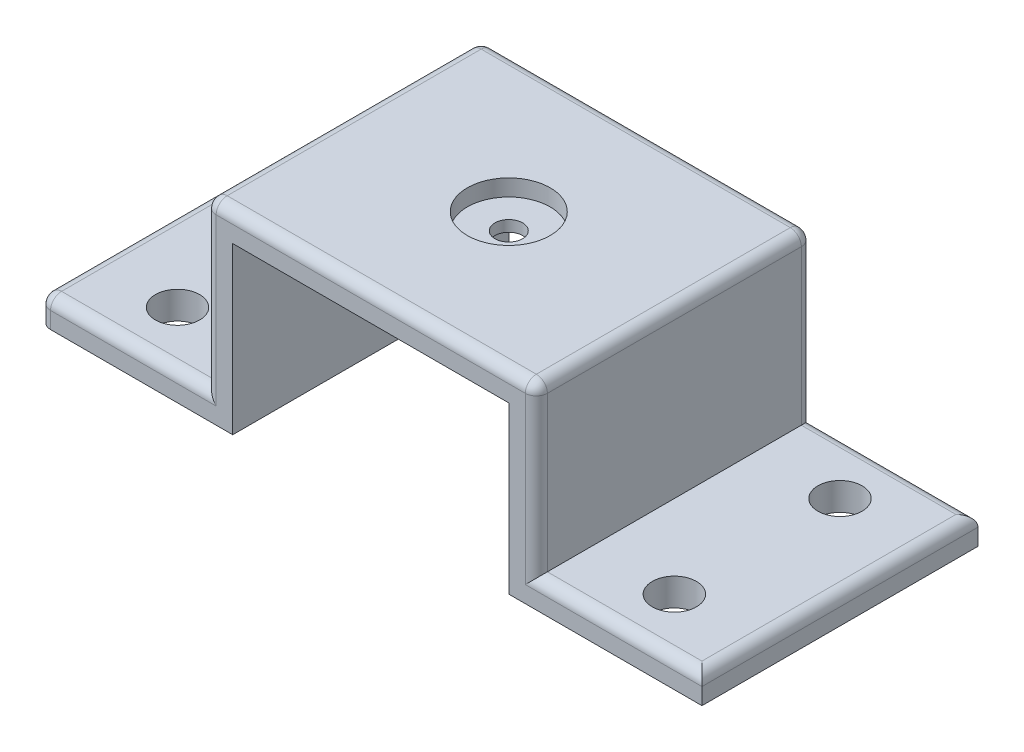
ISO-10303-21;
HEADER;
FILE_DESCRIPTION(('STEP AP214'),'2;1');
FILE_NAME('part.step','',(''),(''),'','','');
FILE_SCHEMA(('AUTOMOTIVE_DESIGN { 1 0 10303 214 1 1 1 1 }'));
ENDSEC;
DATA;
#1=APPLICATION_CONTEXT('core data for automotive mechanical design processes');
#2=APPLICATION_PROTOCOL_DEFINITION('international standard','automotive_design',2000,#1);
#3=PRODUCT_CONTEXT('',#1,'mechanical');
#4=PRODUCT('Part','Part','',(#3));
#5=PRODUCT_RELATED_PRODUCT_CATEGORY('part','',(#4));
#6=PRODUCT_DEFINITION_FORMATION('','',#4);
#7=PRODUCT_DEFINITION_CONTEXT('part definition',#1,'design');
#8=PRODUCT_DEFINITION('design','',#6,#7);
#9=PRODUCT_DEFINITION_SHAPE('','',#8);
#10=(LENGTH_UNIT() NAMED_UNIT(*) SI_UNIT(.MILLI.,.METRE.));
#11=(NAMED_UNIT(*) PLANE_ANGLE_UNIT() SI_UNIT($,.RADIAN.));
#12=(NAMED_UNIT(*) SI_UNIT($,.STERADIAN.) SOLID_ANGLE_UNIT());
#13=UNCERTAINTY_MEASURE_WITH_UNIT(LENGTH_MEASURE(1.E-05),#10,'distance_accuracy_value','');
#14=(GEOMETRIC_REPRESENTATION_CONTEXT(3) GLOBAL_UNCERTAINTY_ASSIGNED_CONTEXT((#13)) GLOBAL_UNIT_ASSIGNED_CONTEXT((#10,
#11,#12)) REPRESENTATION_CONTEXT('',''));
#15=CARTESIAN_POINT('',(0.,0.,0.));
#16=DIRECTION('',(0.,0.,1.));
#17=DIRECTION('',(1.,0.,0.));
#18=AXIS2_PLACEMENT_3D('',#15,#16,#17);
#19=CARTESIAN_POINT('',(38.1,31.75,31.75));
#20=DIRECTION('',(0.,1.,0.));
#21=DIRECTION('',(-1.,0.,0.));
#22=AXIS2_PLACEMENT_3D('',#19,#20,#21);
#23=PLANE('',#22);
#24=CARTESIAN_POINT('',(57.15,31.75,19.05));
#25=DIRECTION('',(0.,1.,0.));
#26=DIRECTION('',(0.,0.,1.));
#27=AXIS2_PLACEMENT_3D('',#24,#25,#26);
#28=CIRCLE('',#27,5.08);
#29=CARTESIAN_POINT('',(57.15,31.75,24.13));
#30=VERTEX_POINT('',#29);
#31=EDGE_CURVE('E433',#30,#30,#28,.T.);
#32=ORIENTED_EDGE('',*,*,#31,.T.);
#33=EDGE_LOOP('',(#32));
#34=FACE_BOUND('',#33,.T.);
#35=CARTESIAN_POINT('',(57.15,31.75,-19.05));
#36=DIRECTION('',(0.,1.,0.));
#37=DIRECTION('',(0.,0.,1.));
#38=AXIS2_PLACEMENT_3D('',#35,#36,#37);
#39=CIRCLE('',#38,5.08);
#40=CARTESIAN_POINT('',(57.15,31.75,-13.97));
#41=VERTEX_POINT('',#40);
#42=EDGE_CURVE('E414',#41,#41,#39,.T.);
#43=ORIENTED_EDGE('',*,*,#42,.T.);
#44=EDGE_LOOP('',(#43));
#45=FACE_BOUND('',#44,.T.);
#46=DIRECTION('',(1.,0.,0.));
#47=VECTOR('',#46,1.);
#48=CARTESIAN_POINT('',(38.1,31.75,-31.75));
#49=LINE('',#48,#47);
#50=CARTESIAN_POINT('',(31.75,31.75,-31.75));
#51=VERTEX_POINT('',#50);
#52=CARTESIAN_POINT('',(76.2,31.75,-31.75));
#53=VERTEX_POINT('',#52);
#54=EDGE_CURVE('E218',#51,#53,#49,.T.);
#55=ORIENTED_EDGE('',*,*,#54,.T.);
#56=DIRECTION('',(0.,0.,-1.));
#57=VECTOR('',#56,1.);
#58=CARTESIAN_POINT('',(76.2,31.75,31.75));
#59=LINE('',#58,#57);
#60=CARTESIAN_POINT('',(76.2,31.75,31.75));
#61=VERTEX_POINT('',#60);
#62=EDGE_CURVE('E197',#61,#53,#59,.T.);
#63=ORIENTED_EDGE('',*,*,#62,.F.);
#64=DIRECTION('',(1.,0.,0.));
#65=VECTOR('',#64,1.);
#66=CARTESIAN_POINT('',(38.1,31.75,31.75));
#67=LINE('',#66,#65);
#68=CARTESIAN_POINT('',(31.75,31.75,31.75));
#69=VERTEX_POINT('',#68);
#70=EDGE_CURVE('E205',#69,#61,#67,.T.);
#71=ORIENTED_EDGE('',*,*,#70,.F.);
#72=DIRECTION('',(0.,0.,-1.));
#73=VECTOR('',#72,1.);
#74=CARTESIAN_POINT('',(31.75,31.75,31.75));
#75=LINE('',#74,#73);
#76=EDGE_CURVE('E454',#69,#51,#75,.T.);
#77=ORIENTED_EDGE('',*,*,#76,.T.);
#78=EDGE_LOOP('',(#55,#63,#71,#77));
#79=FACE_BOUND('',#78,.T.);
#80=ADVANCED_FACE('F47',(#34,#45,#79),#23,.F.);
#81=CARTESIAN_POINT('',(76.2,38.1,31.75));
#82=DIRECTION('',(1.,0.,0.));
#83=DIRECTION('',(0.,0.,-1.));
#84=AXIS2_PLACEMENT_3D('',#81,#82,#83);
#85=PLANE('',#84);
#86=DIRECTION('',(0.,-1.,0.));
#87=VECTOR('',#86,1.);
#88=CARTESIAN_POINT('',(76.2,38.1,-31.75));
#89=LINE('',#88,#87);
#90=CARTESIAN_POINT('',(76.2,35.56,-31.75));
#91=VERTEX_POINT('',#90);
#92=EDGE_CURVE('E457',#91,#53,#89,.T.);
#93=ORIENTED_EDGE('',*,*,#92,.F.);
#94=DIRECTION('',(0.,0.,-1.));
#95=VECTOR('',#94,1.);
#96=CARTESIAN_POINT('',(76.2,35.56,31.75));
#97=LINE('',#96,#95);
#98=CARTESIAN_POINT('',(76.2,35.56,31.75));
#99=VERTEX_POINT('',#98);
#100=EDGE_CURVE('E200',#91,#99,#97,.F.);
#101=ORIENTED_EDGE('',*,*,#100,.T.);
#102=DIRECTION('',(0.,-1.,0.));
#103=VECTOR('',#102,1.);
#104=CARTESIAN_POINT('',(76.2,38.1,31.75));
#105=LINE('',#104,#103);
#106=EDGE_CURVE('E192',#99,#61,#105,.T.);
#107=ORIENTED_EDGE('',*,*,#106,.T.);
#108=ORIENTED_EDGE('',*,*,#62,.T.);
#109=EDGE_LOOP('',(#93,#101,#107,#108));
#110=FACE_BOUND('',#109,.T.);
#111=ADVANCED_FACE('F195',(#110),#85,.T.);
#112=CARTESIAN_POINT('',(38.1,38.1,31.75));
#113=DIRECTION('',(0.,1.,0.));
#114=DIRECTION('',(-1.,0.,0.));
#115=AXIS2_PLACEMENT_3D('',#112,#113,#114);
#116=PLANE('',#115);
#117=CARTESIAN_POINT('',(57.15,38.1,19.05));
#118=DIRECTION('',(0.,1.,0.));
#119=DIRECTION('',(0.,0.,1.));
#120=AXIS2_PLACEMENT_3D('',#117,#118,#119);
#121=CIRCLE('',#120,5.08);
#122=CARTESIAN_POINT('',(57.15,38.1,24.13));
#123=VERTEX_POINT('',#122);
#124=EDGE_CURVE('E693',#123,#123,#121,.T.);
#125=ORIENTED_EDGE('',*,*,#124,.F.);
#126=EDGE_LOOP('',(#125));
#127=FACE_BOUND('',#126,.T.);
#128=CARTESIAN_POINT('',(57.15,38.1,-19.05));
#129=DIRECTION('',(0.,1.,0.));
#130=DIRECTION('',(0.,0.,1.));
#131=AXIS2_PLACEMENT_3D('',#128,#129,#130);
#132=CIRCLE('',#131,5.08);
#133=CARTESIAN_POINT('',(57.15,38.1,-13.97));
#134=VERTEX_POINT('',#133);
#135=EDGE_CURVE('E408',#134,#134,#132,.T.);
#136=ORIENTED_EDGE('',*,*,#135,.F.);
#137=EDGE_LOOP('',(#136));
#138=FACE_BOUND('',#137,.T.);
#139=DIRECTION('',(0.,0.,-1.));
#140=VECTOR('',#139,1.);
#141=CARTESIAN_POINT('',(73.66,38.1,31.75));
#142=LINE('',#141,#140);
#143=CARTESIAN_POINT('',(73.66,38.1,29.21));
#144=VERTEX_POINT('',#143);
#145=CARTESIAN_POINT('',(73.66,38.1,-29.21));
#146=VERTEX_POINT('',#145);
#147=EDGE_CURVE('E291',#144,#146,#142,.T.);
#148=ORIENTED_EDGE('',*,*,#147,.T.);
#149=DIRECTION('',(1.,0.,0.));
#150=VECTOR('',#149,1.);
#151=CARTESIAN_POINT('',(38.1,38.1,-29.21));
#152=LINE('',#151,#150);
#153=CARTESIAN_POINT('',(38.1,38.1,-29.21));
#154=VERTEX_POINT('',#153);
#155=EDGE_CURVE('E297',#146,#154,#152,.F.);
#156=ORIENTED_EDGE('',*,*,#155,.T.);
#157=DIRECTION('',(0.,0.,-1.));
#158=VECTOR('',#157,1.);
#159=CARTESIAN_POINT('',(38.1,38.1,31.75));
#160=LINE('',#159,#158);
#161=CARTESIAN_POINT('',(38.1,38.1,29.21));
#162=VERTEX_POINT('',#161);
#163=EDGE_CURVE('E221',#162,#154,#160,.T.);
#164=ORIENTED_EDGE('',*,*,#163,.F.);
#165=DIRECTION('',(1.,0.,0.));
#166=VECTOR('',#165,1.);
#167=CARTESIAN_POINT('',(76.2,38.1,29.21));
#168=LINE('',#167,#166);
#169=EDGE_CURVE('E294',#162,#144,#168,.T.);
#170=ORIENTED_EDGE('',*,*,#169,.T.);
#171=EDGE_LOOP('',(#148,#156,#164,#170));
#172=FACE_BOUND('',#171,.T.);
#173=ADVANCED_FACE('F559',(#127,#138,#172),#116,.T.);
#174=CARTESIAN_POINT('',(38.1,76.2,31.75));
#175=DIRECTION('',(1.,0.,0.));
#176=DIRECTION('',(0.,0.,-1.));
#177=AXIS2_PLACEMENT_3D('',#174,#175,#176);
#178=PLANE('',#177);
#179=ORIENTED_EDGE('',*,*,#163,.T.);
#180=DIRECTION('',(0.,-1.,0.));
#181=VECTOR('',#180,1.);
#182=CARTESIAN_POINT('',(38.1,76.2,-29.21));
#183=LINE('',#182,#181);
#184=CARTESIAN_POINT('',(38.1,73.66,-29.21));
#185=VERTEX_POINT('',#184);
#186=EDGE_CURVE('E279',#154,#185,#183,.F.);
#187=ORIENTED_EDGE('',*,*,#186,.T.);
#188=DIRECTION('',(0.,0.,-1.));
#189=VECTOR('',#188,1.);
#190=CARTESIAN_POINT('',(38.1,73.66,31.75));
#191=LINE('',#190,#189);
#192=CARTESIAN_POINT('',(38.1,73.66,29.21));
#193=VERTEX_POINT('',#192);
#194=EDGE_CURVE('E275',#185,#193,#191,.F.);
#195=ORIENTED_EDGE('',*,*,#194,.T.);
#196=DIRECTION('',(0.,-1.,0.));
#197=VECTOR('',#196,1.);
#198=CARTESIAN_POINT('',(38.1,38.1,29.21));
#199=LINE('',#198,#197);
#200=EDGE_CURVE('E272',#193,#162,#199,.T.);
#201=ORIENTED_EDGE('',*,*,#200,.T.);
#202=EDGE_LOOP('',(#179,#187,#195,#201));
#203=FACE_BOUND('',#202,.T.);
#204=ADVANCED_FACE('F562',(#203),#178,.T.);
#205=CARTESIAN_POINT('',(-38.1,76.2,31.75));
#206=DIRECTION('',(0.,1.,0.));
#207=DIRECTION('',(0.,0.,1.));
#208=AXIS2_PLACEMENT_3D('',#205,#206,#207);
#209=PLANE('',#208);
#210=DIRECTION('',(0.,0.,-1.));
#211=VECTOR('',#210,1.);
#212=CARTESIAN_POINT('',(35.56,76.2,31.75));
#213=LINE('',#212,#211);
#214=CARTESIAN_POINT('',(35.56,76.2,29.21));
#215=VERTEX_POINT('',#214);
#216=CARTESIAN_POINT('',(35.56,76.2,-29.21));
#217=VERTEX_POINT('',#216);
#218=EDGE_CURVE('E246',#215,#217,#213,.T.);
#219=ORIENTED_EDGE('',*,*,#218,.T.);
#220=DIRECTION('',(1.,0.,0.));
#221=VECTOR('',#220,1.);
#222=CARTESIAN_POINT('',(-38.1,76.2,-29.21));
#223=LINE('',#222,#221);
#224=CARTESIAN_POINT('',(-35.56,76.2,-29.21));
#225=VERTEX_POINT('',#224);
#226=EDGE_CURVE('E253',#217,#225,#223,.F.);
#227=ORIENTED_EDGE('',*,*,#226,.T.);
#228=DIRECTION('',(0.,0.,-1.));
#229=VECTOR('',#228,1.);
#230=CARTESIAN_POINT('',(-35.56,76.2,31.75));
#231=LINE('',#230,#229);
#232=CARTESIAN_POINT('',(-35.56,76.2,29.21));
#233=VERTEX_POINT('',#232);
#234=EDGE_CURVE('E249',#225,#233,#231,.F.);
#235=ORIENTED_EDGE('',*,*,#234,.T.);
#236=DIRECTION('',(1.,0.,0.));
#237=VECTOR('',#236,1.);
#238=CARTESIAN_POINT('',(38.1,76.2,29.21));
#239=LINE('',#238,#237);
#240=EDGE_CURVE('E243',#233,#215,#239,.T.);
#241=ORIENTED_EDGE('',*,*,#240,.T.);
#242=EDGE_LOOP('',(#219,#227,#235,#241));
#243=FACE_BOUND('',#242,.T.);
#244=CARTESIAN_POINT('',(0.,76.2,0.));
#245=DIRECTION('',(0.,1.,0.));
#246=DIRECTION('',(0.,0.,1.));
#247=AXIS2_PLACEMENT_3D('',#244,#245,#246);
#248=CIRCLE('',#247,9.525);
#249=CARTESIAN_POINT('',(0.,76.2,9.525));
#250=VERTEX_POINT('',#249);
#251=EDGE_CURVE('E428',#250,#250,#248,.T.);
#252=ORIENTED_EDGE('',*,*,#251,.F.);
#253=EDGE_LOOP('',(#252));
#254=FACE_BOUND('',#253,.T.);
#255=ADVANCED_FACE('F681',(#243,#254),#209,.T.);
#256=CARTESIAN_POINT('',(-38.1,38.1,31.75));
#257=DIRECTION('',(-1.,0.,0.));
#258=DIRECTION('',(0.,0.,1.));
#259=AXIS2_PLACEMENT_3D('',#256,#257,#258);
#260=PLANE('',#259);
#261=DIRECTION('',(0.,0.,-1.));
#262=VECTOR('',#261,1.);
#263=CARTESIAN_POINT('',(-38.1,73.66,31.75));
#264=LINE('',#263,#262);
#265=CARTESIAN_POINT('',(-38.1,73.66,29.21));
#266=VERTEX_POINT('',#265);
#267=CARTESIAN_POINT('',(-38.1,73.66,-29.21));
#268=VERTEX_POINT('',#267);
#269=EDGE_CURVE('E225',#266,#268,#264,.T.);
#270=ORIENTED_EDGE('',*,*,#269,.T.);
#271=DIRECTION('',(0.,1.,0.));
#272=VECTOR('',#271,1.);
#273=CARTESIAN_POINT('',(-38.1,38.1,-29.21));
#274=LINE('',#273,#272);
#275=CARTESIAN_POINT('',(-38.1,38.1,-29.21));
#276=VERTEX_POINT('',#275);
#277=EDGE_CURVE('E240',#268,#276,#274,.F.);
#278=ORIENTED_EDGE('',*,*,#277,.T.);
#279=DIRECTION('',(0.,0.,-1.));
#280=VECTOR('',#279,1.);
#281=CARTESIAN_POINT('',(-38.1,38.1,31.75));
#282=LINE('',#281,#280);
#283=CARTESIAN_POINT('',(-38.1,38.1,29.21));
#284=VERTEX_POINT('',#283);
#285=EDGE_CURVE('E228',#284,#276,#282,.T.);
#286=ORIENTED_EDGE('',*,*,#285,.F.);
#287=DIRECTION('',(0.,1.,0.));
#288=VECTOR('',#287,1.);
#289=CARTESIAN_POINT('',(-38.1,76.2,29.21));
#290=LINE('',#289,#288);
#291=EDGE_CURVE('E220',#284,#266,#290,.T.);
#292=ORIENTED_EDGE('',*,*,#291,.T.);
#293=EDGE_LOOP('',(#270,#278,#286,#292));
#294=FACE_BOUND('',#293,.T.);
#295=ADVANCED_FACE('F535',(#294),#260,.T.);
#296=CARTESIAN_POINT('',(-76.2,38.1,31.75));
#297=DIRECTION('',(0.,1.,0.));
#298=DIRECTION('',(0.,0.,1.));
#299=AXIS2_PLACEMENT_3D('',#296,#297,#298);
#300=PLANE('',#299);
#301=ORIENTED_EDGE('',*,*,#285,.T.);
#302=DIRECTION('',(1.,0.,0.));
#303=VECTOR('',#302,1.);
#304=CARTESIAN_POINT('',(-76.2,38.1,-29.21));
#305=LINE('',#304,#303);
#306=CARTESIAN_POINT('',(-73.66,38.1,-29.21));
#307=VERTEX_POINT('',#306);
#308=EDGE_CURVE('E288',#276,#307,#305,.F.);
#309=ORIENTED_EDGE('',*,*,#308,.T.);
#310=DIRECTION('',(0.,0.,-1.));
#311=VECTOR('',#310,1.);
#312=CARTESIAN_POINT('',(-73.66,38.1,31.75));
#313=LINE('',#312,#311);
#314=CARTESIAN_POINT('',(-73.66,38.1,29.21));
#315=VERTEX_POINT('',#314);
#316=EDGE_CURVE('E282',#307,#315,#313,.F.);
#317=ORIENTED_EDGE('',*,*,#316,.T.);
#318=DIRECTION('',(1.,0.,0.));
#319=VECTOR('',#318,1.);
#320=CARTESIAN_POINT('',(-38.1,38.1,29.21));
#321=LINE('',#320,#319);
#322=EDGE_CURVE('E285',#315,#284,#321,.T.);
#323=ORIENTED_EDGE('',*,*,#322,.T.);
#324=EDGE_LOOP('',(#301,#309,#317,#323));
#325=FACE_BOUND('',#324,.T.);
#326=CARTESIAN_POINT('',(-57.15,38.1,-19.05));
#327=DIRECTION('',(0.,1.,0.));
#328=DIRECTION('',(0.,0.,1.));
#329=AXIS2_PLACEMENT_3D('',#326,#327,#328);
#330=CIRCLE('',#329,5.08);
#331=CARTESIAN_POINT('',(-57.15,38.1,-13.97));
#332=VERTEX_POINT('',#331);
#333=EDGE_CURVE('E420',#332,#332,#330,.T.);
#334=ORIENTED_EDGE('',*,*,#333,.F.);
#335=EDGE_LOOP('',(#334));
#336=FACE_BOUND('',#335,.T.);
#337=CARTESIAN_POINT('',(-57.15,38.1,19.05));
#338=DIRECTION('',(0.,1.,0.));
#339=DIRECTION('',(0.,0.,1.));
#340=AXIS2_PLACEMENT_3D('',#337,#338,#339);
#341=CIRCLE('',#340,5.08);
#342=CARTESIAN_POINT('',(-57.15,38.1,24.13));
#343=VERTEX_POINT('',#342);
#344=EDGE_CURVE('E429',#343,#343,#341,.T.);
#345=ORIENTED_EDGE('',*,*,#344,.F.);
#346=EDGE_LOOP('',(#345));
#347=FACE_BOUND('',#346,.T.);
#348=ADVANCED_FACE('F496',(#325,#336,#347),#300,.T.);
#349=CARTESIAN_POINT('',(-76.2,31.75,31.75));
#350=DIRECTION('',(-1.,0.,0.));
#351=DIRECTION('',(0.,0.,1.));
#352=AXIS2_PLACEMENT_3D('',#349,#350,#351);
#353=PLANE('',#352);
#354=DIRECTION('',(0.,1.,0.));
#355=VECTOR('',#354,1.);
#356=CARTESIAN_POINT('',(-76.2,38.1,29.21));
#357=LINE('',#356,#355);
#358=CARTESIAN_POINT('',(-76.2,31.75,29.21));
#359=VERTEX_POINT('',#358);
#360=CARTESIAN_POINT('',(-76.2,35.56,29.21));
#361=VERTEX_POINT('',#360);
#362=EDGE_CURVE('E65',#359,#361,#357,.T.);
#363=ORIENTED_EDGE('',*,*,#362,.T.);
#364=DIRECTION('',(0.,0.,-1.));
#365=VECTOR('',#364,1.);
#366=CARTESIAN_POINT('',(-76.2,35.56,31.75));
#367=LINE('',#366,#365);
#368=CARTESIAN_POINT('',(-76.2,35.56,-31.75));
#369=VERTEX_POINT('',#368);
#370=EDGE_CURVE('E57',#361,#369,#367,.T.);
#371=ORIENTED_EDGE('',*,*,#370,.T.);
#372=DIRECTION('',(0.,1.,0.));
#373=VECTOR('',#372,1.);
#374=CARTESIAN_POINT('',(-76.2,31.75,-31.75));
#375=LINE('',#374,#373);
#376=CARTESIAN_POINT('',(-76.2,31.75,-31.75));
#377=VERTEX_POINT('',#376);
#378=EDGE_CURVE('E460',#377,#369,#375,.T.);
#379=ORIENTED_EDGE('',*,*,#378,.F.);
#380=DIRECTION('',(0.,0.,-1.));
#381=VECTOR('',#380,1.);
#382=CARTESIAN_POINT('',(-76.2,31.75,31.75));
#383=LINE('',#382,#381);
#384=EDGE_CURVE('E489',#359,#377,#383,.T.);
#385=ORIENTED_EDGE('',*,*,#384,.F.);
#386=EDGE_LOOP('',(#363,#371,#379,#385));
#387=FACE_BOUND('',#386,.T.);
#388=ADVANCED_FACE('F673',(#387),#353,.T.);
#389=CARTESIAN_POINT('',(-76.2,31.75,31.75));
#390=DIRECTION('',(0.,1.,0.));
#391=DIRECTION('',(0.,0.,1.));
#392=AXIS2_PLACEMENT_3D('',#389,#390,#391);
#393=PLANE('',#392);
#394=CARTESIAN_POINT('',(-57.15,31.75,-19.05));
#395=DIRECTION('',(0.,1.,0.));
#396=DIRECTION('',(0.,0.,1.));
#397=AXIS2_PLACEMENT_3D('',#394,#395,#396);
#398=CIRCLE('',#397,5.08);
#399=CARTESIAN_POINT('',(-57.15,31.75,-13.97));
#400=VERTEX_POINT('',#399);
#401=EDGE_CURVE('E696',#400,#400,#398,.T.);
#402=ORIENTED_EDGE('',*,*,#401,.T.);
#403=EDGE_LOOP('',(#402));
#404=FACE_BOUND('',#403,.T.);
#405=CARTESIAN_POINT('',(-57.15,31.75,19.05));
#406=DIRECTION('',(0.,1.,0.));
#407=DIRECTION('',(0.,0.,1.));
#408=AXIS2_PLACEMENT_3D('',#405,#406,#407);
#409=CIRCLE('',#408,5.08);
#410=CARTESIAN_POINT('',(-57.15,31.75,24.13));
#411=VERTEX_POINT('',#410);
#412=EDGE_CURVE('E424',#411,#411,#409,.T.);
#413=ORIENTED_EDGE('',*,*,#412,.T.);
#414=EDGE_LOOP('',(#413));
#415=FACE_BOUND('',#414,.T.);
#416=DIRECTION('',(1.,0.,0.));
#417=VECTOR('',#416,1.);
#418=CARTESIAN_POINT('',(-76.2,31.75,31.75));
#419=LINE('',#418,#417);
#420=CARTESIAN_POINT('',(-73.66,31.75,31.75));
#421=VERTEX_POINT('',#420);
#422=CARTESIAN_POINT('',(-31.75,31.75,31.75));
#423=VERTEX_POINT('',#422);
#424=EDGE_CURVE('E204',#421,#423,#419,.T.);
#425=ORIENTED_EDGE('',*,*,#424,.F.);
#426=CARTESIAN_POINT('',(-73.66,31.75,29.21));
#427=DIRECTION('',(0.,1.,0.));
#428=DIRECTION('',(0.,0.,1.));
#429=AXIS2_PLACEMENT_3D('',#426,#427,#428);
#430=CIRCLE('',#429,2.54);
#431=EDGE_CURVE('E11',#421,#359,#430,.F.);
#432=ORIENTED_EDGE('',*,*,#431,.T.);
#433=ORIENTED_EDGE('',*,*,#384,.T.);
#434=DIRECTION('',(1.,0.,0.));
#435=VECTOR('',#434,1.);
#436=CARTESIAN_POINT('',(-76.2,31.75,-31.75));
#437=LINE('',#436,#435);
#438=CARTESIAN_POINT('',(-31.75,31.75,-31.75));
#439=VERTEX_POINT('',#438);
#440=EDGE_CURVE('E464',#377,#439,#437,.T.);
#441=ORIENTED_EDGE('',*,*,#440,.T.);
#442=DIRECTION('',(0.,0.,-1.));
#443=VECTOR('',#442,1.);
#444=CARTESIAN_POINT('',(-31.75,31.75,31.75));
#445=LINE('',#444,#443);
#446=EDGE_CURVE('E485',#423,#439,#445,.T.);
#447=ORIENTED_EDGE('',*,*,#446,.F.);
#448=EDGE_LOOP('',(#425,#432,#433,#441,#447));
#449=FACE_BOUND('',#448,.T.);
#450=ADVANCED_FACE('F645',(#404,#415,#449),#393,.F.);
#451=CARTESIAN_POINT('',(-31.75,38.1,31.75));
#452=DIRECTION('',(-1.,0.,0.));
#453=DIRECTION('',(0.,0.,1.));
#454=AXIS2_PLACEMENT_3D('',#451,#452,#453);
#455=PLANE('',#454);
#456=DIRECTION('',(0.,1.,0.));
#457=VECTOR('',#456,1.);
#458=CARTESIAN_POINT('',(-31.75,38.1,-31.75));
#459=LINE('',#458,#457);
#460=CARTESIAN_POINT('',(-31.75,69.85,-31.75));
#461=VERTEX_POINT('',#460);
#462=EDGE_CURVE('E467',#439,#461,#459,.T.);
#463=ORIENTED_EDGE('',*,*,#462,.T.);
#464=DIRECTION('',(0.,0.,-1.));
#465=VECTOR('',#464,1.);
#466=CARTESIAN_POINT('',(-31.75,69.85,31.75));
#467=LINE('',#466,#465);
#468=CARTESIAN_POINT('',(-31.75,69.85,31.75));
#469=VERTEX_POINT('',#468);
#470=EDGE_CURVE('E481',#469,#461,#467,.T.);
#471=ORIENTED_EDGE('',*,*,#470,.F.);
#472=DIRECTION('',(0.,1.,0.));
#473=VECTOR('',#472,1.);
#474=CARTESIAN_POINT('',(-31.75,38.1,31.75));
#475=LINE('',#474,#473);
#476=EDGE_CURVE('E446',#423,#469,#475,.T.);
#477=ORIENTED_EDGE('',*,*,#476,.F.);
#478=ORIENTED_EDGE('',*,*,#446,.T.);
#479=EDGE_LOOP('',(#463,#471,#477,#478));
#480=FACE_BOUND('',#479,.T.);
#481=ADVANCED_FACE('F649',(#480),#455,.F.);
#482=CARTESIAN_POINT('',(-38.1,69.85,31.75));
#483=DIRECTION('',(0.,1.,0.));
#484=DIRECTION('',(0.,0.,1.));
#485=AXIS2_PLACEMENT_3D('',#482,#483,#484);
#486=PLANE('',#485);
#487=CARTESIAN_POINT('',(0.,69.85,0.));
#488=DIRECTION('',(0.,1.,0.));
#489=DIRECTION('',(0.,0.,1.));
#490=AXIS2_PLACEMENT_3D('',#487,#488,#489);
#491=CIRCLE('',#490,3.17499999999999);
#492=CARTESIAN_POINT('',(0.,69.85,3.17499999999999));
#493=VERTEX_POINT('',#492);
#494=EDGE_CURVE('E232',#493,#493,#491,.T.);
#495=ORIENTED_EDGE('',*,*,#494,.T.);
#496=EDGE_LOOP('',(#495));
#497=FACE_BOUND('',#496,.T.);
#498=DIRECTION('',(1.,0.,0.));
#499=VECTOR('',#498,1.);
#500=CARTESIAN_POINT('',(-38.1,69.85,-31.75));
#501=LINE('',#500,#499);
#502=CARTESIAN_POINT('',(31.75,69.85,-31.75));
#503=VERTEX_POINT('',#502);
#504=EDGE_CURVE('E470',#461,#503,#501,.T.);
#505=ORIENTED_EDGE('',*,*,#504,.T.);
#506=DIRECTION('',(0.,0.,-1.));
#507=VECTOR('',#506,1.);
#508=CARTESIAN_POINT('',(31.75,69.85,31.75));
#509=LINE('',#508,#507);
#510=CARTESIAN_POINT('',(31.75,69.85,31.75));
#511=VERTEX_POINT('',#510);
#512=EDGE_CURVE('E477',#511,#503,#509,.T.);
#513=ORIENTED_EDGE('',*,*,#512,.F.);
#514=DIRECTION('',(1.,0.,0.));
#515=VECTOR('',#514,1.);
#516=CARTESIAN_POINT('',(-38.1,69.85,31.75));
#517=LINE('',#516,#515);
#518=EDGE_CURVE('E449',#469,#511,#517,.T.);
#519=ORIENTED_EDGE('',*,*,#518,.F.);
#520=ORIENTED_EDGE('',*,*,#470,.T.);
#521=EDGE_LOOP('',(#505,#513,#519,#520));
#522=FACE_BOUND('',#521,.T.);
#523=ADVANCED_FACE('F653',(#497,#522),#486,.F.);
#524=CARTESIAN_POINT('',(31.75,76.2,31.75));
#525=DIRECTION('',(1.,0.,0.));
#526=DIRECTION('',(0.,0.,-1.));
#527=AXIS2_PLACEMENT_3D('',#524,#525,#526);
#528=PLANE('',#527);
#529=DIRECTION('',(0.,1.,0.));
#530=VECTOR('',#529,1.);
#531=CARTESIAN_POINT('',(31.75,76.2,-31.75));
#532=LINE('',#531,#530);
#533=EDGE_CURVE('E215',#503,#51,#532,.F.);
#534=ORIENTED_EDGE('',*,*,#533,.T.);
#535=ORIENTED_EDGE('',*,*,#76,.F.);
#536=DIRECTION('',(0.,1.,0.));
#537=VECTOR('',#536,1.);
#538=CARTESIAN_POINT('',(31.75,76.2,31.75));
#539=LINE('',#538,#537);
#540=EDGE_CURVE('E210',#511,#69,#539,.F.);
#541=ORIENTED_EDGE('',*,*,#540,.F.);
#542=ORIENTED_EDGE('',*,*,#512,.T.);
#543=EDGE_LOOP('',(#534,#535,#541,#542));
#544=FACE_BOUND('',#543,.T.);
#545=ADVANCED_FACE('F657',(#544),#528,.F.);
#546=CARTESIAN_POINT('',(0.,0.,31.75));
#547=DIRECTION('',(0.,0.,-1.));
#548=DIRECTION('',(-1.,0.,0.));
#549=AXIS2_PLACEMENT_3D('',#546,#547,#548);
#550=PLANE('',#549);
#551=ORIENTED_EDGE('',*,*,#106,.F.);
#552=DIRECTION('',(1.,0.,0.));
#553=VECTOR('',#552,1.);
#554=CARTESIAN_POINT('',(38.1,35.56,31.75));
#555=LINE('',#554,#553);
#556=CARTESIAN_POINT('',(35.56,35.56,31.75));
#557=VERTEX_POINT('',#556);
#558=EDGE_CURVE('E315',#99,#557,#555,.F.);
#559=ORIENTED_EDGE('',*,*,#558,.T.);
#560=DIRECTION('',(0.,-1.,0.));
#561=VECTOR('',#560,1.);
#562=CARTESIAN_POINT('',(35.56,76.2,31.75));
#563=LINE('',#562,#561);
#564=CARTESIAN_POINT('',(35.56,73.66,31.75));
#565=VERTEX_POINT('',#564);
#566=EDGE_CURVE('E312',#557,#565,#563,.F.);
#567=ORIENTED_EDGE('',*,*,#566,.T.);
#568=DIRECTION('',(1.,0.,0.));
#569=VECTOR('',#568,1.);
#570=CARTESIAN_POINT('',(-38.1,73.66,31.75));
#571=LINE('',#570,#569);
#572=CARTESIAN_POINT('',(-35.56,73.66,31.75));
#573=VERTEX_POINT('',#572);
#574=EDGE_CURVE('E309',#565,#573,#571,.F.);
#575=ORIENTED_EDGE('',*,*,#574,.T.);
#576=DIRECTION('',(0.,1.,0.));
#577=VECTOR('',#576,1.);
#578=CARTESIAN_POINT('',(-35.56,38.1,31.75));
#579=LINE('',#578,#577);
#580=CARTESIAN_POINT('',(-35.56,35.56,31.75));
#581=VERTEX_POINT('',#580);
#582=EDGE_CURVE('E306',#573,#581,#579,.F.);
#583=ORIENTED_EDGE('',*,*,#582,.T.);
#584=DIRECTION('',(1.,0.,0.));
#585=VECTOR('',#584,1.);
#586=CARTESIAN_POINT('',(-76.2,35.56,31.75));
#587=LINE('',#586,#585);
#588=CARTESIAN_POINT('',(-73.66,35.56,31.75));
#589=VERTEX_POINT('',#588);
#590=EDGE_CURVE('E303',#581,#589,#587,.F.);
#591=ORIENTED_EDGE('',*,*,#590,.T.);
#592=DIRECTION('',(0.,1.,0.));
#593=VECTOR('',#592,1.);
#594=CARTESIAN_POINT('',(-73.66,31.75,31.75));
#595=LINE('',#594,#593);
#596=EDGE_CURVE('E300',#589,#421,#595,.F.);
#597=ORIENTED_EDGE('',*,*,#596,.T.);
#598=ORIENTED_EDGE('',*,*,#424,.T.);
#599=ORIENTED_EDGE('',*,*,#476,.T.);
#600=ORIENTED_EDGE('',*,*,#518,.T.);
#601=ORIENTED_EDGE('',*,*,#540,.T.);
#602=ORIENTED_EDGE('',*,*,#70,.T.);
#603=EDGE_LOOP('',(#551,#559,#567,#575,#583,#591,#597,#598,#599,#600,#601,#602));
#604=FACE_BOUND('',#603,.T.);
#605=ADVANCED_FACE('F208',(#604),#550,.F.);
#606=CARTESIAN_POINT('',(0.,0.,-31.75));
#607=DIRECTION('',(0.,0.,-1.));
#608=DIRECTION('',(-1.,0.,0.));
#609=AXIS2_PLACEMENT_3D('',#606,#607,#608);
#610=PLANE('',#609);
#611=ORIENTED_EDGE('',*,*,#378,.T.);
#612=DIRECTION('',(1.,0.,0.));
#613=VECTOR('',#612,1.);
#614=CARTESIAN_POINT('',(0.,35.56,-31.75));
#615=LINE('',#614,#613);
#616=CARTESIAN_POINT('',(-35.56,35.56,-31.75));
#617=VERTEX_POINT('',#616);
#618=EDGE_CURVE('E269',#369,#617,#615,.T.);
#619=ORIENTED_EDGE('',*,*,#618,.T.);
#620=DIRECTION('',(0.,1.,0.));
#621=VECTOR('',#620,1.);
#622=CARTESIAN_POINT('',(-35.56,0.,-31.75));
#623=LINE('',#622,#621);
#624=CARTESIAN_POINT('',(-35.56,73.66,-31.75));
#625=VERTEX_POINT('',#624);
#626=EDGE_CURVE('E265',#617,#625,#623,.T.);
#627=ORIENTED_EDGE('',*,*,#626,.T.);
#628=DIRECTION('',(1.,0.,0.));
#629=VECTOR('',#628,1.);
#630=CARTESIAN_POINT('',(0.,73.66,-31.75));
#631=LINE('',#630,#629);
#632=CARTESIAN_POINT('',(35.56,73.66,-31.75));
#633=VERTEX_POINT('',#632);
#634=EDGE_CURVE('E262',#625,#633,#631,.T.);
#635=ORIENTED_EDGE('',*,*,#634,.T.);
#636=DIRECTION('',(0.,-1.,0.));
#637=VECTOR('',#636,1.);
#638=CARTESIAN_POINT('',(35.56,0.,-31.75));
#639=LINE('',#638,#637);
#640=CARTESIAN_POINT('',(35.56,35.56,-31.75));
#641=VERTEX_POINT('',#640);
#642=EDGE_CURVE('E259',#633,#641,#639,.T.);
#643=ORIENTED_EDGE('',*,*,#642,.T.);
#644=DIRECTION('',(1.,0.,0.));
#645=VECTOR('',#644,1.);
#646=CARTESIAN_POINT('',(0.,35.56,-31.75));
#647=LINE('',#646,#645);
#648=EDGE_CURVE('E256',#641,#91,#647,.T.);
#649=ORIENTED_EDGE('',*,*,#648,.T.);
#650=ORIENTED_EDGE('',*,*,#92,.T.);
#651=ORIENTED_EDGE('',*,*,#54,.F.);
#652=ORIENTED_EDGE('',*,*,#533,.F.);
#653=ORIENTED_EDGE('',*,*,#504,.F.);
#654=ORIENTED_EDGE('',*,*,#462,.F.);
#655=ORIENTED_EDGE('',*,*,#440,.F.);
#656=EDGE_LOOP('',(#611,#619,#627,#635,#643,#649,#650,#651,#652,#653,#654,#655));
#657=FACE_BOUND('',#656,.T.);
#658=ADVANCED_FACE('F514',(#657),#610,.T.);
#659=CARTESIAN_POINT('',(0.,76.2,0.));
#660=DIRECTION('',(0.,1.,0.));
#661=DIRECTION('',(0.,0.,1.));
#662=AXIS2_PLACEMENT_3D('',#659,#660,#661);
#663=CYLINDRICAL_SURFACE('',#662,3.17499999999999);
#664=CARTESIAN_POINT('',(0.,72.39,0.));
#665=DIRECTION('',(0.,1.,0.));
#666=DIRECTION('',(0.,0.,1.));
#667=AXIS2_PLACEMENT_3D('',#664,#665,#666);
#668=CIRCLE('',#667,3.175);
#669=CARTESIAN_POINT('',(0.,72.39,3.175));
#670=VERTEX_POINT('',#669);
#671=EDGE_CURVE('E235',#670,#670,#668,.T.);
#672=ORIENTED_EDGE('',*,*,#671,.T.);
#673=EDGE_LOOP('',(#672));
#674=FACE_BOUND('',#673,.T.);
#675=ORIENTED_EDGE('',*,*,#494,.F.);
#676=EDGE_LOOP('',(#675));
#677=FACE_BOUND('',#676,.T.);
#678=ADVANCED_FACE('F728',(#674,#677),#663,.F.);
#679=CARTESIAN_POINT('',(3.175,72.39,0.));
#680=DIRECTION('',(0.,-1.,0.));
#681=DIRECTION('',(0.,0.,-1.));
#682=AXIS2_PLACEMENT_3D('',#679,#680,#681);
#683=PLANE('',#682);
#684=ORIENTED_EDGE('',*,*,#671,.F.);
#685=EDGE_LOOP('',(#684));
#686=FACE_BOUND('',#685,.T.);
#687=CARTESIAN_POINT('',(0.,72.39,0.));
#688=DIRECTION('',(0.,1.,0.));
#689=DIRECTION('',(0.,0.,1.));
#690=AXIS2_PLACEMENT_3D('',#687,#688,#689);
#691=CIRCLE('',#690,9.525);
#692=CARTESIAN_POINT('',(0.,72.39,9.525));
#693=VERTEX_POINT('',#692);
#694=EDGE_CURVE('E437',#693,#693,#691,.T.);
#695=ORIENTED_EDGE('',*,*,#694,.T.);
#696=EDGE_LOOP('',(#695));
#697=FACE_BOUND('',#696,.T.);
#698=ADVANCED_FACE('F720',(#686,#697),#683,.F.);
#699=CARTESIAN_POINT('',(0.,76.2,0.));
#700=DIRECTION('',(0.,1.,0.));
#701=DIRECTION('',(0.,0.,1.));
#702=AXIS2_PLACEMENT_3D('',#699,#700,#701);
#703=CYLINDRICAL_SURFACE('',#702,9.525);
#704=ORIENTED_EDGE('',*,*,#694,.F.);
#705=EDGE_LOOP('',(#704));
#706=FACE_BOUND('',#705,.T.);
#707=ORIENTED_EDGE('',*,*,#251,.T.);
#708=EDGE_LOOP('',(#707));
#709=FACE_BOUND('',#708,.T.);
#710=ADVANCED_FACE('F712',(#706,#709),#703,.F.);
#711=CARTESIAN_POINT('',(-57.15,31.75,19.05));
#712=DIRECTION('',(0.,1.,0.));
#713=DIRECTION('',(0.,0.,1.));
#714=AXIS2_PLACEMENT_3D('',#711,#712,#713);
#715=CYLINDRICAL_SURFACE('',#714,5.08);
#716=ORIENTED_EDGE('',*,*,#412,.F.);
#717=EDGE_LOOP('',(#716));
#718=FACE_BOUND('',#717,.T.);
#719=ORIENTED_EDGE('',*,*,#344,.T.);
#720=EDGE_LOOP('',(#719));
#721=FACE_BOUND('',#720,.T.);
#722=ADVANCED_FACE('F711',(#718,#721),#715,.F.);
#723=CARTESIAN_POINT('',(-57.15,31.75,-19.05));
#724=DIRECTION('',(0.,1.,0.));
#725=DIRECTION('',(0.,0.,1.));
#726=AXIS2_PLACEMENT_3D('',#723,#724,#725);
#727=CYLINDRICAL_SURFACE('',#726,5.08);
#728=ORIENTED_EDGE('',*,*,#401,.F.);
#729=EDGE_LOOP('',(#728));
#730=FACE_BOUND('',#729,.T.);
#731=ORIENTED_EDGE('',*,*,#333,.T.);
#732=EDGE_LOOP('',(#731));
#733=FACE_BOUND('',#732,.T.);
#734=ADVANCED_FACE('F707',(#730,#733),#727,.F.);
#735=CARTESIAN_POINT('',(57.15,31.75,-19.05));
#736=DIRECTION('',(0.,1.,0.));
#737=DIRECTION('',(0.,0.,1.));
#738=AXIS2_PLACEMENT_3D('',#735,#736,#737);
#739=CYLINDRICAL_SURFACE('',#738,5.08);
#740=ORIENTED_EDGE('',*,*,#42,.F.);
#741=EDGE_LOOP('',(#740));
#742=FACE_BOUND('',#741,.T.);
#743=ORIENTED_EDGE('',*,*,#135,.T.);
#744=EDGE_LOOP('',(#743));
#745=FACE_BOUND('',#744,.T.);
#746=ADVANCED_FACE('F581',(#742,#745),#739,.F.);
#747=CARTESIAN_POINT('',(57.15,31.75,19.05));
#748=DIRECTION('',(0.,1.,0.));
#749=DIRECTION('',(0.,0.,1.));
#750=AXIS2_PLACEMENT_3D('',#747,#748,#749);
#751=CYLINDRICAL_SURFACE('',#750,5.08);
#752=ORIENTED_EDGE('',*,*,#31,.F.);
#753=EDGE_LOOP('',(#752));
#754=FACE_BOUND('',#753,.T.);
#755=ORIENTED_EDGE('',*,*,#124,.T.);
#756=EDGE_LOOP('',(#755));
#757=FACE_BOUND('',#756,.T.);
#758=ADVANCED_FACE('F574',(#754,#757),#751,.F.);
#759=CARTESIAN_POINT('',(73.66,35.56,31.75));
#760=DIRECTION('',(0.,0.,-1.));
#761=DIRECTION('',(-1.,0.,0.));
#762=AXIS2_PLACEMENT_3D('',#759,#760,#761);
#763=CYLINDRICAL_SURFACE('',#762,2.54);
#764=CARTESIAN_POINT('',(73.66,35.56,-29.21));
#765=DIRECTION('',(-0.707106781186547,0.,-0.707106781186547));
#766=DIRECTION('',(0.707106781186547,0.,-0.707106781186547));
#767=AXIS2_PLACEMENT_3D('',#764,#765,#766);
#768=ELLIPSE('',#767,3.59210244842766,2.54);
#769=EDGE_CURVE('E399',#146,#91,#768,.T.);
#770=ORIENTED_EDGE('',*,*,#769,.F.);
#771=ORIENTED_EDGE('',*,*,#147,.F.);
#772=CARTESIAN_POINT('',(73.66,35.56,29.21));
#773=DIRECTION('',(0.707106781186547,0.,-0.707106781186547));
#774=DIRECTION('',(-0.707106781186547,0.,-0.707106781186547));
#775=AXIS2_PLACEMENT_3D('',#772,#773,#774);
#776=ELLIPSE('',#775,3.59210244842766,2.54);
#777=EDGE_CURVE('E51',#99,#144,#776,.F.);
#778=ORIENTED_EDGE('',*,*,#777,.F.);
#779=ORIENTED_EDGE('',*,*,#100,.F.);
#780=EDGE_LOOP('',(#770,#771,#778,#779));
#781=FACE_BOUND('',#780,.T.);
#782=ADVANCED_FACE('F49',(#781),#763,.T.);
#783=CARTESIAN_POINT('',(38.1,35.56,29.21));
#784=DIRECTION('',(-1.,0.,0.));
#785=DIRECTION('',(0.,-1.,0.));
#786=AXIS2_PLACEMENT_3D('',#783,#784,#785);
#787=CYLINDRICAL_SURFACE('',#786,2.54);
#788=ORIENTED_EDGE('',*,*,#777,.T.);
#789=ORIENTED_EDGE('',*,*,#169,.F.);
#790=CARTESIAN_POINT('',(35.56,35.56,29.21));
#791=DIRECTION('',(-0.707106781186548,0.707106781186547,0.));
#792=DIRECTION('',(-0.707106781186547,-0.707106781186548,0.));
#793=AXIS2_PLACEMENT_3D('',#790,#791,#792);
#794=ELLIPSE('',#793,3.59210244842766,2.54);
#795=EDGE_CURVE('E396',#557,#162,#794,.T.);
#796=ORIENTED_EDGE('',*,*,#795,.F.);
#797=ORIENTED_EDGE('',*,*,#558,.F.);
#798=EDGE_LOOP('',(#788,#789,#796,#797));
#799=FACE_BOUND('',#798,.T.);
#800=ADVANCED_FACE('F571',(#799),#787,.T.);
#801=CARTESIAN_POINT('',(-73.66,31.75,29.21));
#802=DIRECTION('',(0.,-1.,0.));
#803=DIRECTION('',(0.,0.,-1.));
#804=AXIS2_PLACEMENT_3D('',#801,#802,#803);
#805=CYLINDRICAL_SURFACE('',#804,2.54);
#806=ORIENTED_EDGE('',*,*,#431,.F.);
#807=ORIENTED_EDGE('',*,*,#596,.F.);
#808=CARTESIAN_POINT('',(-73.66,35.56,29.21));
#809=DIRECTION('',(0.,1.,0.));
#810=DIRECTION('',(0.,0.,1.));
#811=AXIS2_PLACEMENT_3D('',#808,#809,#810);
#812=CIRCLE('',#811,2.54);
#813=EDGE_CURVE('E392',#361,#589,#812,.T.);
#814=ORIENTED_EDGE('',*,*,#813,.F.);
#815=ORIENTED_EDGE('',*,*,#362,.F.);
#816=EDGE_LOOP('',(#806,#807,#814,#815));
#817=FACE_BOUND('',#816,.T.);
#818=ADVANCED_FACE('F579',(#817),#805,.T.);
#819=CARTESIAN_POINT('',(0.,35.56,-29.21));
#820=DIRECTION('',(1.,0.,0.));
#821=DIRECTION('',(0.,1.,0.));
#822=AXIS2_PLACEMENT_3D('',#819,#820,#821);
#823=CYLINDRICAL_SURFACE('',#822,2.54);
#824=ORIENTED_EDGE('',*,*,#769,.T.);
#825=ORIENTED_EDGE('',*,*,#648,.F.);
#826=CARTESIAN_POINT('',(35.56,35.56,-29.21));
#827=DIRECTION('',(0.707106781186548,-0.707106781186547,0.));
#828=DIRECTION('',(-0.707106781186547,-0.707106781186548,0.));
#829=AXIS2_PLACEMENT_3D('',#826,#827,#828);
#830=ELLIPSE('',#829,3.59210244842766,2.54);
#831=EDGE_CURVE('E384',#154,#641,#830,.F.);
#832=ORIENTED_EDGE('',*,*,#831,.F.);
#833=ORIENTED_EDGE('',*,*,#155,.F.);
#834=EDGE_LOOP('',(#824,#825,#832,#833));
#835=FACE_BOUND('',#834,.T.);
#836=ADVANCED_FACE('F556',(#835),#823,.T.);
#837=CARTESIAN_POINT('',(35.56,76.2,29.21));
#838=DIRECTION('',(0.,1.,0.));
#839=DIRECTION('',(0.,0.,1.));
#840=AXIS2_PLACEMENT_3D('',#837,#838,#839);
#841=CYLINDRICAL_SURFACE('',#840,2.54);
#842=ORIENTED_EDGE('',*,*,#795,.T.);
#843=ORIENTED_EDGE('',*,*,#200,.F.);
#844=CARTESIAN_POINT('',(35.56,73.66,29.21));
#845=DIRECTION('',(0.,1.,0.));
#846=DIRECTION('',(0.,0.,1.));
#847=AXIS2_PLACEMENT_3D('',#844,#845,#846);
#848=CIRCLE('',#847,2.54);
#849=EDGE_CURVE('E377',#565,#193,#848,.T.);
#850=ORIENTED_EDGE('',*,*,#849,.F.);
#851=ORIENTED_EDGE('',*,*,#566,.F.);
#852=EDGE_LOOP('',(#842,#843,#850,#851));
#853=FACE_BOUND('',#852,.T.);
#854=ADVANCED_FACE('F567',(#853),#841,.T.);
#855=CARTESIAN_POINT('',(-73.66,35.56,29.21));
#856=DIRECTION('',(-1.,0.,0.));
#857=DIRECTION('',(0.,0.,1.));
#858=AXIS2_PLACEMENT_3D('',#855,#856,#857);
#859=SPHERICAL_SURFACE('',#858,2.54);
#860=CARTESIAN_POINT('',(-73.66,35.56,29.21));
#861=DIRECTION('',(-1.,0.,0.));
#862=DIRECTION('',(0.,0.,1.));
#863=AXIS2_PLACEMENT_3D('',#860,#861,#862);
#864=CIRCLE('',#863,2.54);
#865=EDGE_CURVE('E373',#315,#589,#864,.F.);
#866=ORIENTED_EDGE('',*,*,#865,.F.);
#867=CARTESIAN_POINT('',(-73.66,35.56,29.21));
#868=DIRECTION('',(0.,0.,1.));
#869=DIRECTION('',(1.,0.,0.));
#870=AXIS2_PLACEMENT_3D('',#867,#868,#869);
#871=CIRCLE('',#870,2.54);
#872=EDGE_CURVE('E388',#361,#315,#871,.F.);
#873=ORIENTED_EDGE('',*,*,#872,.F.);
#874=ORIENTED_EDGE('',*,*,#813,.T.);
#875=EDGE_LOOP('',(#866,#873,#874));
#876=FACE_BOUND('',#875,.T.);
#877=ADVANCED_FACE('F525',(#876),#859,.T.);
#878=CARTESIAN_POINT('',(-73.66,35.56,31.75));
#879=DIRECTION('',(0.,0.,-1.));
#880=DIRECTION('',(-1.,0.,0.));
#881=AXIS2_PLACEMENT_3D('',#878,#879,#880);
#882=CYLINDRICAL_SURFACE('',#881,2.54);
#883=ORIENTED_EDGE('',*,*,#872,.T.);
#884=ORIENTED_EDGE('',*,*,#316,.F.);
#885=CARTESIAN_POINT('',(-73.66,35.56,-29.21));
#886=DIRECTION('',(0.707106781186547,0.,-0.707106781186547));
#887=DIRECTION('',(-0.707106781186547,0.,-0.707106781186547));
#888=AXIS2_PLACEMENT_3D('',#885,#886,#887);
#889=ELLIPSE('',#888,3.59210244842766,2.54);
#890=EDGE_CURVE('E369',#369,#307,#889,.T.);
#891=ORIENTED_EDGE('',*,*,#890,.F.);
#892=ORIENTED_EDGE('',*,*,#370,.F.);
#893=EDGE_LOOP('',(#883,#884,#891,#892));
#894=FACE_BOUND('',#893,.T.);
#895=ADVANCED_FACE('F521',(#894),#882,.T.);
#896=CARTESIAN_POINT('',(35.56,0.,-29.21));
#897=DIRECTION('',(0.,-1.,0.));
#898=DIRECTION('',(0.,0.,-1.));
#899=AXIS2_PLACEMENT_3D('',#896,#897,#898);
#900=CYLINDRICAL_SURFACE('',#899,2.54);
#901=ORIENTED_EDGE('',*,*,#831,.T.);
#902=ORIENTED_EDGE('',*,*,#642,.F.);
#903=CARTESIAN_POINT('',(35.56,73.66,-29.21));
#904=DIRECTION('',(0.,1.,0.));
#905=DIRECTION('',(0.,0.,1.));
#906=AXIS2_PLACEMENT_3D('',#903,#904,#905);
#907=CIRCLE('',#906,2.54);
#908=EDGE_CURVE('E365',#185,#633,#907,.T.);
#909=ORIENTED_EDGE('',*,*,#908,.F.);
#910=ORIENTED_EDGE('',*,*,#186,.F.);
#911=EDGE_LOOP('',(#901,#902,#909,#910));
#912=FACE_BOUND('',#911,.T.);
#913=ADVANCED_FACE('F554',(#912),#900,.T.);
#914=CARTESIAN_POINT('',(35.56,73.66,31.75));
#915=DIRECTION('',(0.,0.,-1.));
#916=DIRECTION('',(-1.,0.,0.));
#917=AXIS2_PLACEMENT_3D('',#914,#915,#916);
#918=CYLINDRICAL_SURFACE('',#917,2.54);
#919=CARTESIAN_POINT('',(35.56,73.66,29.21));
#920=DIRECTION('',(0.,0.,1.));
#921=DIRECTION('',(1.,0.,0.));
#922=AXIS2_PLACEMENT_3D('',#919,#920,#921);
#923=CIRCLE('',#922,2.54);
#924=EDGE_CURVE('E380',#193,#215,#923,.T.);
#925=ORIENTED_EDGE('',*,*,#924,.F.);
#926=ORIENTED_EDGE('',*,*,#194,.F.);
#927=CARTESIAN_POINT('',(35.56,73.66,-29.21));
#928=DIRECTION('',(0.,0.,-1.));
#929=DIRECTION('',(-1.,0.,0.));
#930=AXIS2_PLACEMENT_3D('',#927,#928,#929);
#931=CIRCLE('',#930,2.54);
#932=EDGE_CURVE('E361',#217,#185,#931,.T.);
#933=ORIENTED_EDGE('',*,*,#932,.F.);
#934=ORIENTED_EDGE('',*,*,#218,.F.);
#935=EDGE_LOOP('',(#925,#926,#933,#934));
#936=FACE_BOUND('',#935,.T.);
#937=ADVANCED_FACE('F624',(#936),#918,.T.);
#938=CARTESIAN_POINT('',(35.56,73.66,29.21));
#939=DIRECTION('',(1.,0.,0.));
#940=DIRECTION('',(0.,0.,-1.));
#941=AXIS2_PLACEMENT_3D('',#938,#939,#940);
#942=SPHERICAL_SURFACE('',#941,2.54);
#943=ORIENTED_EDGE('',*,*,#849,.T.);
#944=ORIENTED_EDGE('',*,*,#924,.T.);
#945=CARTESIAN_POINT('',(35.56,73.66,29.21));
#946=DIRECTION('',(1.,0.,0.));
#947=DIRECTION('',(0.,0.,-1.));
#948=AXIS2_PLACEMENT_3D('',#945,#946,#947);
#949=CIRCLE('',#948,2.54);
#950=EDGE_CURVE('E357',#565,#215,#949,.F.);
#951=ORIENTED_EDGE('',*,*,#950,.F.);
#952=EDGE_LOOP('',(#943,#944,#951));
#953=FACE_BOUND('',#952,.T.);
#954=ADVANCED_FACE('F621',(#953),#942,.T.);
#955=CARTESIAN_POINT('',(-76.2,35.56,29.21));
#956=DIRECTION('',(-1.,0.,0.));
#957=DIRECTION('',(0.,0.,1.));
#958=AXIS2_PLACEMENT_3D('',#955,#956,#957);
#959=CYLINDRICAL_SURFACE('',#958,2.54);
#960=ORIENTED_EDGE('',*,*,#865,.T.);
#961=ORIENTED_EDGE('',*,*,#590,.F.);
#962=CARTESIAN_POINT('',(-35.56,35.56,29.21));
#963=DIRECTION('',(-0.707106781186547,-0.707106781186547,0.));
#964=DIRECTION('',(0.707106781186547,-0.707106781186547,0.));
#965=AXIS2_PLACEMENT_3D('',#962,#963,#964);
#966=ELLIPSE('',#965,3.59210244842766,2.54);
#967=EDGE_CURVE('E353',#284,#581,#966,.F.);
#968=ORIENTED_EDGE('',*,*,#967,.F.);
#969=ORIENTED_EDGE('',*,*,#322,.F.);
#970=EDGE_LOOP('',(#960,#961,#968,#969));
#971=FACE_BOUND('',#970,.T.);
#972=ADVANCED_FACE('F528',(#971),#959,.T.);
#973=CARTESIAN_POINT('',(0.,35.56,-29.21));
#974=DIRECTION('',(1.,0.,0.));
#975=DIRECTION('',(0.,0.,-1.));
#976=AXIS2_PLACEMENT_3D('',#973,#974,#975);
#977=CYLINDRICAL_SURFACE('',#976,2.54);
#978=ORIENTED_EDGE('',*,*,#890,.T.);
#979=ORIENTED_EDGE('',*,*,#308,.F.);
#980=CARTESIAN_POINT('',(-35.56,35.56,-29.21));
#981=DIRECTION('',(0.707106781186547,0.707106781186547,0.));
#982=DIRECTION('',(-0.707106781186547,0.707106781186547,0.));
#983=AXIS2_PLACEMENT_3D('',#980,#981,#982);
#984=ELLIPSE('',#983,3.59210244842766,2.54);
#985=EDGE_CURVE('E349',#617,#276,#984,.T.);
#986=ORIENTED_EDGE('',*,*,#985,.F.);
#987=ORIENTED_EDGE('',*,*,#618,.F.);
#988=EDGE_LOOP('',(#978,#979,#986,#987));
#989=FACE_BOUND('',#988,.T.);
#990=ADVANCED_FACE('F504',(#989),#977,.T.);
#991=CARTESIAN_POINT('',(35.56,73.66,-29.21));
#992=DIRECTION('',(1.,0.,0.));
#993=DIRECTION('',(0.,0.,-1.));
#994=AXIS2_PLACEMENT_3D('',#991,#992,#993);
#995=SPHERICAL_SURFACE('',#994,2.54);
#996=ORIENTED_EDGE('',*,*,#932,.T.);
#997=ORIENTED_EDGE('',*,*,#908,.T.);
#998=CARTESIAN_POINT('',(35.56,73.66,-29.21));
#999=DIRECTION('',(1.,0.,0.));
#1000=DIRECTION('',(0.,0.,-1.));
#1001=AXIS2_PLACEMENT_3D('',#998,#999,#1000);
#1002=CIRCLE('',#1001,2.54);
#1003=EDGE_CURVE('E345',#217,#633,#1002,.F.);
#1004=ORIENTED_EDGE('',*,*,#1003,.F.);
#1005=EDGE_LOOP('',(#996,#997,#1004));
#1006=FACE_BOUND('',#1005,.T.);
#1007=ADVANCED_FACE('F549',(#1006),#995,.T.);
#1008=CARTESIAN_POINT('',(-38.1,73.66,29.21));
#1009=DIRECTION('',(-1.,0.,0.));
#1010=DIRECTION('',(0.,0.,1.));
#1011=AXIS2_PLACEMENT_3D('',#1008,#1009,#1010);
#1012=CYLINDRICAL_SURFACE('',#1011,2.54);
#1013=ORIENTED_EDGE('',*,*,#950,.T.);
#1014=ORIENTED_EDGE('',*,*,#240,.F.);
#1015=CARTESIAN_POINT('',(-35.56,73.66,29.21));
#1016=DIRECTION('',(-1.,0.,0.));
#1017=DIRECTION('',(0.,0.,1.));
#1018=AXIS2_PLACEMENT_3D('',#1015,#1016,#1017);
#1019=CIRCLE('',#1018,2.54);
#1020=EDGE_CURVE('E341',#573,#233,#1019,.T.);
#1021=ORIENTED_EDGE('',*,*,#1020,.F.);
#1022=ORIENTED_EDGE('',*,*,#574,.F.);
#1023=EDGE_LOOP('',(#1013,#1014,#1021,#1022));
#1024=FACE_BOUND('',#1023,.T.);
#1025=ADVANCED_FACE('F611',(#1024),#1012,.T.);
#1026=CARTESIAN_POINT('',(-35.56,38.1,29.21));
#1027=DIRECTION('',(0.,-1.,0.));
#1028=DIRECTION('',(0.,0.,-1.));
#1029=AXIS2_PLACEMENT_3D('',#1026,#1027,#1028);
#1030=CYLINDRICAL_SURFACE('',#1029,2.54);
#1031=ORIENTED_EDGE('',*,*,#967,.T.);
#1032=ORIENTED_EDGE('',*,*,#582,.F.);
#1033=CARTESIAN_POINT('',(-35.56,73.66,29.21));
#1034=DIRECTION('',(0.,1.,0.));
#1035=DIRECTION('',(0.,0.,1.));
#1036=AXIS2_PLACEMENT_3D('',#1033,#1034,#1035);
#1037=CIRCLE('',#1036,2.54);
#1038=EDGE_CURVE('E337',#266,#573,#1037,.T.);
#1039=ORIENTED_EDGE('',*,*,#1038,.F.);
#1040=ORIENTED_EDGE('',*,*,#291,.F.);
#1041=EDGE_LOOP('',(#1031,#1032,#1039,#1040));
#1042=FACE_BOUND('',#1041,.T.);
#1043=ADVANCED_FACE('F533',(#1042),#1030,.T.);
#1044=CARTESIAN_POINT('',(-35.56,0.,-29.21));
#1045=DIRECTION('',(0.,1.,0.));
#1046=DIRECTION('',(0.,0.,1.));
#1047=AXIS2_PLACEMENT_3D('',#1044,#1045,#1046);
#1048=CYLINDRICAL_SURFACE('',#1047,2.54);
#1049=ORIENTED_EDGE('',*,*,#985,.T.);
#1050=ORIENTED_EDGE('',*,*,#277,.F.);
#1051=CARTESIAN_POINT('',(-35.56,73.66,-29.21));
#1052=DIRECTION('',(0.,1.,0.));
#1053=DIRECTION('',(0.,0.,1.));
#1054=AXIS2_PLACEMENT_3D('',#1051,#1052,#1053);
#1055=CIRCLE('',#1054,2.54);
#1056=EDGE_CURVE('E333',#625,#268,#1055,.T.);
#1057=ORIENTED_EDGE('',*,*,#1056,.F.);
#1058=ORIENTED_EDGE('',*,*,#626,.F.);
#1059=EDGE_LOOP('',(#1049,#1050,#1057,#1058));
#1060=FACE_BOUND('',#1059,.T.);
#1061=ADVANCED_FACE('F510',(#1060),#1048,.T.);
#1062=CARTESIAN_POINT('',(0.,73.66,-29.21));
#1063=DIRECTION('',(1.,0.,0.));
#1064=DIRECTION('',(0.,0.,-1.));
#1065=AXIS2_PLACEMENT_3D('',#1062,#1063,#1064);
#1066=CYLINDRICAL_SURFACE('',#1065,2.54);
#1067=ORIENTED_EDGE('',*,*,#1003,.T.);
#1068=ORIENTED_EDGE('',*,*,#634,.F.);
#1069=CARTESIAN_POINT('',(-35.56,73.66,-29.21));
#1070=DIRECTION('',(-1.,0.,0.));
#1071=DIRECTION('',(0.,0.,1.));
#1072=AXIS2_PLACEMENT_3D('',#1069,#1070,#1071);
#1073=CIRCLE('',#1072,2.54);
#1074=EDGE_CURVE('E330',#225,#625,#1073,.T.);
#1075=ORIENTED_EDGE('',*,*,#1074,.F.);
#1076=ORIENTED_EDGE('',*,*,#226,.F.);
#1077=EDGE_LOOP('',(#1067,#1068,#1075,#1076));
#1078=FACE_BOUND('',#1077,.T.);
#1079=ADVANCED_FACE('F546',(#1078),#1066,.T.);
#1080=CARTESIAN_POINT('',(-35.56,73.66,29.21));
#1081=DIRECTION('',(0.,0.,1.));
#1082=DIRECTION('',(1.,0.,0.));
#1083=AXIS2_PLACEMENT_3D('',#1080,#1081,#1082);
#1084=SPHERICAL_SURFACE('',#1083,2.54);
#1085=ORIENTED_EDGE('',*,*,#1038,.T.);
#1086=ORIENTED_EDGE('',*,*,#1020,.T.);
#1087=CARTESIAN_POINT('',(-35.56,73.66,29.21));
#1088=DIRECTION('',(0.,0.,1.));
#1089=DIRECTION('',(1.,0.,0.));
#1090=AXIS2_PLACEMENT_3D('',#1087,#1088,#1089);
#1091=CIRCLE('',#1090,2.54);
#1092=EDGE_CURVE('E327',#266,#233,#1091,.F.);
#1093=ORIENTED_EDGE('',*,*,#1092,.F.);
#1094=EDGE_LOOP('',(#1085,#1086,#1093));
#1095=FACE_BOUND('',#1094,.T.);
#1096=ADVANCED_FACE('F601',(#1095),#1084,.T.);
#1097=CARTESIAN_POINT('',(-35.56,73.66,-29.21));
#1098=DIRECTION('',(0.,0.,-1.));
#1099=DIRECTION('',(-1.,0.,0.));
#1100=AXIS2_PLACEMENT_3D('',#1097,#1098,#1099);
#1101=SPHERICAL_SURFACE('',#1100,2.54);
#1102=ORIENTED_EDGE('',*,*,#1074,.T.);
#1103=ORIENTED_EDGE('',*,*,#1056,.T.);
#1104=CARTESIAN_POINT('',(-35.56,73.66,-29.21));
#1105=DIRECTION('',(0.,0.,-1.));
#1106=DIRECTION('',(-1.,0.,0.));
#1107=AXIS2_PLACEMENT_3D('',#1104,#1105,#1106);
#1108=CIRCLE('',#1107,2.54);
#1109=EDGE_CURVE('E324',#225,#268,#1108,.F.);
#1110=ORIENTED_EDGE('',*,*,#1109,.F.);
#1111=EDGE_LOOP('',(#1102,#1103,#1110));
#1112=FACE_BOUND('',#1111,.T.);
#1113=ADVANCED_FACE('F542',(#1112),#1101,.T.);
#1114=CARTESIAN_POINT('',(-35.56,73.66,31.75));
#1115=DIRECTION('',(0.,0.,-1.));
#1116=DIRECTION('',(-1.,0.,0.));
#1117=AXIS2_PLACEMENT_3D('',#1114,#1115,#1116);
#1118=CYLINDRICAL_SURFACE('',#1117,2.54);
#1119=ORIENTED_EDGE('',*,*,#1092,.T.);
#1120=ORIENTED_EDGE('',*,*,#234,.F.);
#1121=ORIENTED_EDGE('',*,*,#1109,.T.);
#1122=ORIENTED_EDGE('',*,*,#269,.F.);
#1123=EDGE_LOOP('',(#1119,#1120,#1121,#1122));
#1124=FACE_BOUND('',#1123,.T.);
#1125=ADVANCED_FACE('F538',(#1124),#1118,.T.);
#1126=CLOSED_SHELL('',(#80,#111,#173,#204,#255,#295,#348,#388,#450,#481,#523,#545,#605,#658,
#678,#698,#710,#722,#734,#746,#758,#782,#800,#818,#836,#854,#877,#895,#913,#937,#954,#972,#990,
#1007,#1025,#1043,#1061,#1079,#1096,#1113,#1125));
#1127=MANIFOLD_SOLID_BREP('B2',#1126);
#1128=ADVANCED_BREP_SHAPE_REPRESENTATION('',(#18,#1127),#14);
#1129=SHAPE_DEFINITION_REPRESENTATION(#9,#1128);
ENDSEC;
END-ISO-10303-21;
